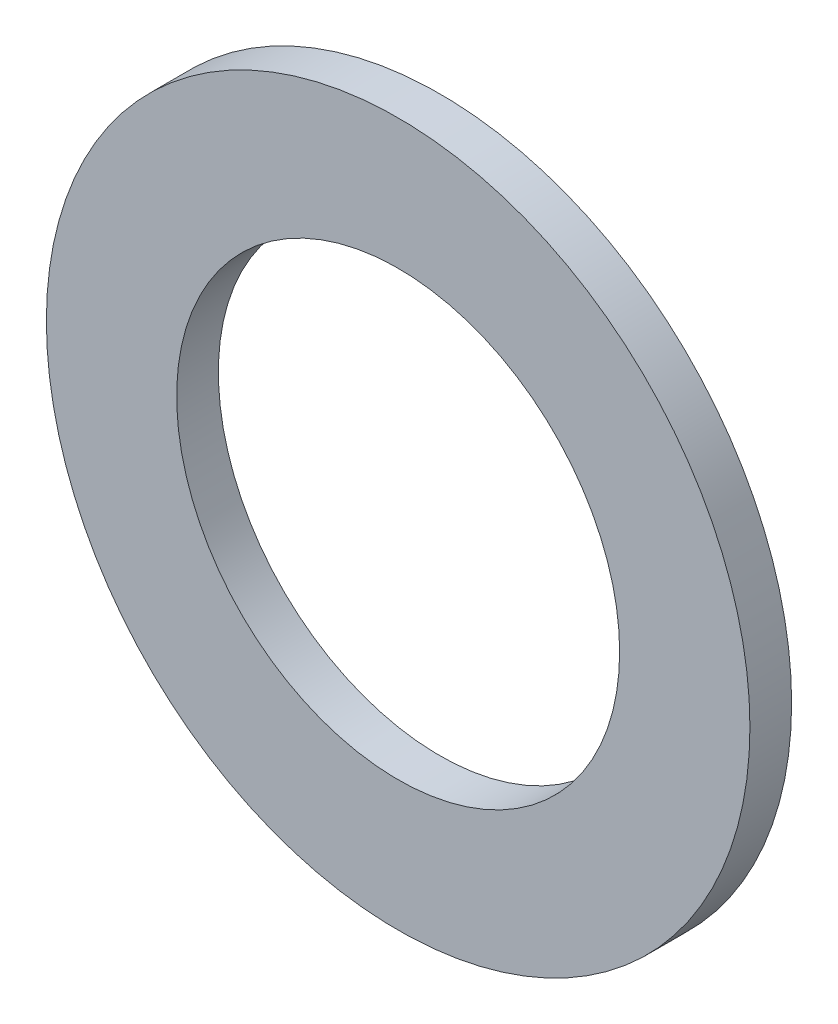
ISO-10303-21;
HEADER;
FILE_DESCRIPTION(('STEP AP214'),'2;1');
FILE_NAME('part.step','',(''),(''),'','','');
FILE_SCHEMA(('AUTOMOTIVE_DESIGN { 1 0 10303 214 1 1 1 1 }'));
ENDSEC;
DATA;
#1=APPLICATION_CONTEXT('core data for automotive mechanical design processes');
#2=APPLICATION_PROTOCOL_DEFINITION('international standard','automotive_design',2000,#1);
#3=PRODUCT_CONTEXT('',#1,'mechanical');
#4=PRODUCT('Part','Part','',(#3));
#5=PRODUCT_RELATED_PRODUCT_CATEGORY('part','',(#4));
#6=PRODUCT_DEFINITION_FORMATION('','',#4);
#7=PRODUCT_DEFINITION_CONTEXT('part definition',#1,'design');
#8=PRODUCT_DEFINITION('design','',#6,#7);
#9=PRODUCT_DEFINITION_SHAPE('','',#8);
#10=(LENGTH_UNIT() NAMED_UNIT(*) SI_UNIT(.MILLI.,.METRE.));
#11=(NAMED_UNIT(*) PLANE_ANGLE_UNIT() SI_UNIT($,.RADIAN.));
#12=(NAMED_UNIT(*) SI_UNIT($,.STERADIAN.) SOLID_ANGLE_UNIT());
#13=UNCERTAINTY_MEASURE_WITH_UNIT(LENGTH_MEASURE(1.E-05),#10,'distance_accuracy_value','');
#14=(GEOMETRIC_REPRESENTATION_CONTEXT(3) GLOBAL_UNCERTAINTY_ASSIGNED_CONTEXT((#13)) GLOBAL_UNIT_ASSIGNED_CONTEXT((#10,
#11,#12)) REPRESENTATION_CONTEXT('',''));
#15=CARTESIAN_POINT('',(0.,0.,0.));
#16=DIRECTION('',(0.,0.,1.));
#17=DIRECTION('',(1.,0.,0.));
#18=AXIS2_PLACEMENT_3D('',#15,#16,#17);
#19=CARTESIAN_POINT('',(0.,0.,0.4));
#20=DIRECTION('',(0.,0.,1.));
#21=DIRECTION('',(1.,0.,0.));
#22=AXIS2_PLACEMENT_3D('',#19,#20,#21);
#23=PLANE('',#22);
#24=CARTESIAN_POINT('',(0.,0.,0.4));
#25=DIRECTION('',(0.,0.,1.));
#26=DIRECTION('',(1.,0.,0.));
#27=AXIS2_PLACEMENT_3D('',#24,#25,#26);
#28=CIRCLE('',#27,6.75);
#29=CARTESIAN_POINT('',(6.75,0.,0.4));
#30=VERTEX_POINT('',#29);
#31=EDGE_CURVE('E10',#30,#30,#28,.T.);
#32=ORIENTED_EDGE('',*,*,#31,.T.);
#33=EDGE_LOOP('',(#32));
#34=FACE_BOUND('',#33,.T.);
#35=CARTESIAN_POINT('',(0.,0.,0.4));
#36=DIRECTION('',(0.,0.,1.));
#37=DIRECTION('',(1.,0.,0.));
#38=AXIS2_PLACEMENT_3D('',#35,#36,#37);
#39=CIRCLE('',#38,4.25);
#40=CARTESIAN_POINT('',(4.25,0.,0.4));
#41=VERTEX_POINT('',#40);
#42=EDGE_CURVE('E42',#41,#41,#39,.T.);
#43=ORIENTED_EDGE('',*,*,#42,.F.);
#44=EDGE_LOOP('',(#43));
#45=FACE_BOUND('',#44,.T.);
#46=ADVANCED_FACE('F31',(#34,#45),#23,.T.);
#47=CARTESIAN_POINT('',(0.,0.,-0.4));
#48=DIRECTION('',(0.,0.,1.));
#49=DIRECTION('',(1.,0.,0.));
#50=AXIS2_PLACEMENT_3D('',#47,#48,#49);
#51=PLANE('',#50);
#52=CARTESIAN_POINT('',(0.,0.,-0.4));
#53=DIRECTION('',(0.,0.,1.));
#54=DIRECTION('',(1.,0.,0.));
#55=AXIS2_PLACEMENT_3D('',#52,#53,#54);
#56=CIRCLE('',#55,6.75);
#57=CARTESIAN_POINT('',(6.75,0.,-0.4));
#58=VERTEX_POINT('',#57);
#59=EDGE_CURVE('E35',#58,#58,#56,.T.);
#60=ORIENTED_EDGE('',*,*,#59,.F.);
#61=EDGE_LOOP('',(#60));
#62=FACE_BOUND('',#61,.T.);
#63=CARTESIAN_POINT('',(0.,0.,-0.4));
#64=DIRECTION('',(0.,0.,1.));
#65=DIRECTION('',(1.,0.,0.));
#66=AXIS2_PLACEMENT_3D('',#63,#64,#65);
#67=CIRCLE('',#66,4.25);
#68=CARTESIAN_POINT('',(4.25,0.,-0.4));
#69=VERTEX_POINT('',#68);
#70=EDGE_CURVE('E44',#69,#69,#67,.T.);
#71=ORIENTED_EDGE('',*,*,#70,.T.);
#72=EDGE_LOOP('',(#71));
#73=FACE_BOUND('',#72,.T.);
#74=ADVANCED_FACE('F54',(#62,#73),#51,.F.);
#75=CARTESIAN_POINT('',(0.,0.,0.4));
#76=DIRECTION('',(0.,0.,-1.));
#77=DIRECTION('',(-1.,0.,0.));
#78=AXIS2_PLACEMENT_3D('',#75,#76,#77);
#79=CYLINDRICAL_SURFACE('',#78,6.75);
#80=ORIENTED_EDGE('',*,*,#31,.F.);
#81=EDGE_LOOP('',(#80));
#82=FACE_BOUND('',#81,.T.);
#83=ORIENTED_EDGE('',*,*,#59,.T.);
#84=EDGE_LOOP('',(#83));
#85=FACE_BOUND('',#84,.T.);
#86=ADVANCED_FACE('F33',(#82,#85),#79,.T.);
#87=CARTESIAN_POINT('',(0.,0.,0.4));
#88=DIRECTION('',(0.,0.,-1.));
#89=DIRECTION('',(-1.,0.,0.));
#90=AXIS2_PLACEMENT_3D('',#87,#88,#89);
#91=CYLINDRICAL_SURFACE('',#90,4.25);
#92=ORIENTED_EDGE('',*,*,#42,.T.);
#93=EDGE_LOOP('',(#92));
#94=FACE_BOUND('',#93,.T.);
#95=ORIENTED_EDGE('',*,*,#70,.F.);
#96=EDGE_LOOP('',(#95));
#97=FACE_BOUND('',#96,.T.);
#98=ADVANCED_FACE('F50',(#94,#97),#91,.F.);
#99=CLOSED_SHELL('',(#46,#74,#86,#98));
#100=MANIFOLD_SOLID_BREP('B2',#99);
#101=ADVANCED_BREP_SHAPE_REPRESENTATION('',(#18,#100),#14);
#102=SHAPE_DEFINITION_REPRESENTATION(#9,#101);
ENDSEC;
END-ISO-10303-21;
